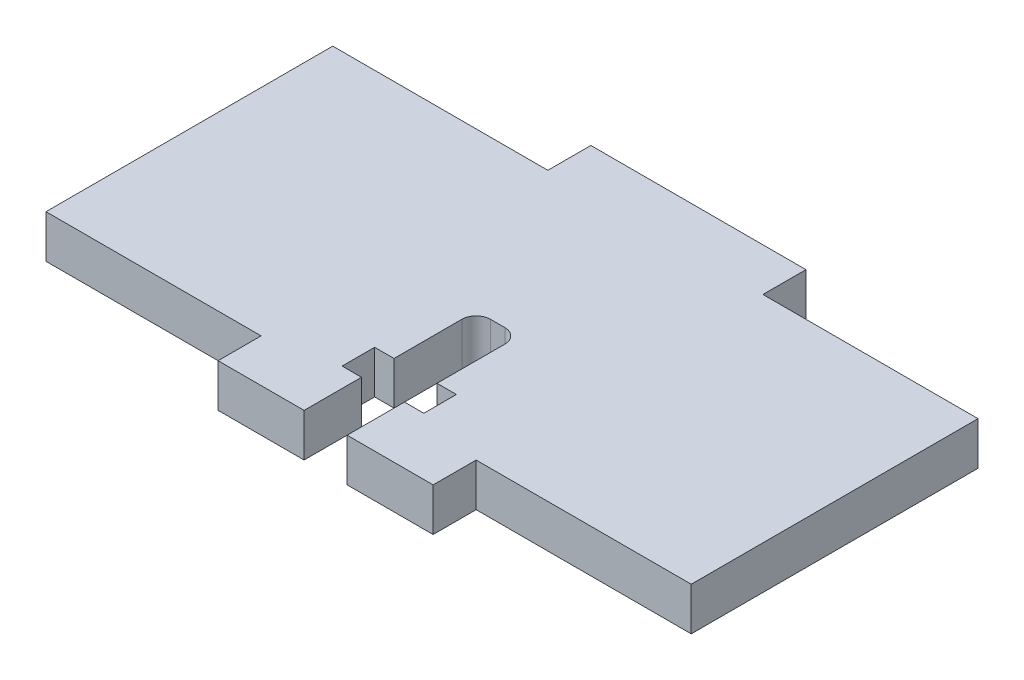
ISO-10303-21;
HEADER;
FILE_DESCRIPTION(('STEP AP214'),'2;1');
FILE_NAME('part.step','',(''),(''),'','','');
FILE_SCHEMA(('AUTOMOTIVE_DESIGN { 1 0 10303 214 1 1 1 1 }'));
ENDSEC;
DATA;
#1=APPLICATION_CONTEXT('core data for automotive mechanical design processes');
#2=APPLICATION_PROTOCOL_DEFINITION('international standard','automotive_design',2000,#1);
#3=PRODUCT_CONTEXT('',#1,'mechanical');
#4=PRODUCT('Part','Part','',(#3));
#5=PRODUCT_RELATED_PRODUCT_CATEGORY('part','',(#4));
#6=PRODUCT_DEFINITION_FORMATION('','',#4);
#7=PRODUCT_DEFINITION_CONTEXT('part definition',#1,'design');
#8=PRODUCT_DEFINITION('design','',#6,#7);
#9=PRODUCT_DEFINITION_SHAPE('','',#8);
#10=(LENGTH_UNIT() NAMED_UNIT(*) SI_UNIT(.MILLI.,.METRE.));
#11=(NAMED_UNIT(*) PLANE_ANGLE_UNIT() SI_UNIT($,.RADIAN.));
#12=(NAMED_UNIT(*) SI_UNIT($,.STERADIAN.) SOLID_ANGLE_UNIT());
#13=UNCERTAINTY_MEASURE_WITH_UNIT(LENGTH_MEASURE(1.E-05),#10,'distance_accuracy_value','');
#14=(GEOMETRIC_REPRESENTATION_CONTEXT(3) GLOBAL_UNCERTAINTY_ASSIGNED_CONTEXT((#13)) GLOBAL_UNIT_ASSIGNED_CONTEXT((#10,
#11,#12)) REPRESENTATION_CONTEXT('',''));
#15=CARTESIAN_POINT('',(0.,0.,0.));
#16=DIRECTION('',(0.,0.,1.));
#17=DIRECTION('',(1.,0.,0.));
#18=AXIS2_PLACEMENT_3D('',#15,#16,#17);
#19=CARTESIAN_POINT('',(-7.5,1.5,13.));
#20=DIRECTION('',(0.,0.,-1.));
#21=DIRECTION('',(-1.,0.,0.));
#22=AXIS2_PLACEMENT_3D('',#19,#20,#21);
#23=PLANE('',#22);
#24=DIRECTION('',(1.,0.,0.));
#25=VECTOR('',#24,1.);
#26=CARTESIAN_POINT('',(-7.5,-1.5,13.));
#27=LINE('',#26,#25);
#28=CARTESIAN_POINT('',(-7.5,-1.5,13.));
#29=VERTEX_POINT('',#28);
#30=CARTESIAN_POINT('',(-1.5,-1.5,13.));
#31=VERTEX_POINT('',#30);
#32=EDGE_CURVE('E227',#29,#31,#27,.T.);
#33=ORIENTED_EDGE('',*,*,#32,.T.);
#34=DIRECTION('',(0.,1.,0.));
#35=VECTOR('',#34,1.);
#36=CARTESIAN_POINT('',(-1.5,-1.5,13.));
#37=LINE('',#36,#35);
#38=CARTESIAN_POINT('',(-1.5,1.5,13.));
#39=VERTEX_POINT('',#38);
#40=EDGE_CURVE('E213',#31,#39,#37,.T.);
#41=ORIENTED_EDGE('',*,*,#40,.T.);
#42=DIRECTION('',(1.,0.,0.));
#43=VECTOR('',#42,1.);
#44=CARTESIAN_POINT('',(-7.5,1.5,13.));
#45=LINE('',#44,#43);
#46=CARTESIAN_POINT('',(-7.5,1.5,13.));
#47=VERTEX_POINT('',#46);
#48=EDGE_CURVE('E225',#47,#39,#45,.T.);
#49=ORIENTED_EDGE('',*,*,#48,.F.);
#50=DIRECTION('',(0.,-1.,0.));
#51=VECTOR('',#50,1.);
#52=CARTESIAN_POINT('',(-7.5,1.5,13.));
#53=LINE('',#52,#51);
#54=EDGE_CURVE('E258',#47,#29,#53,.T.);
#55=ORIENTED_EDGE('',*,*,#54,.T.);
#56=EDGE_LOOP('',(#33,#41,#49,#55));
#57=FACE_BOUND('',#56,.T.);
#58=ADVANCED_FACE('F35',(#57),#23,.F.);
#59=CARTESIAN_POINT('',(22.5,1.5,-10.));
#60=DIRECTION('',(0.,0.,1.));
#61=DIRECTION('',(1.,0.,0.));
#62=AXIS2_PLACEMENT_3D('',#59,#60,#61);
#63=PLANE('',#62);
#64=DIRECTION('',(0.,-1.,0.));
#65=VECTOR('',#64,1.);
#66=CARTESIAN_POINT('',(7.5,1.5,-10.));
#67=LINE('',#66,#65);
#68=CARTESIAN_POINT('',(7.5,1.5,-10.));
#69=VERTEX_POINT('',#68);
#70=CARTESIAN_POINT('',(7.5,-1.5,-10.));
#71=VERTEX_POINT('',#70);
#72=EDGE_CURVE('E247',#69,#71,#67,.T.);
#73=ORIENTED_EDGE('',*,*,#72,.F.);
#74=DIRECTION('',(-1.,0.,0.));
#75=VECTOR('',#74,1.);
#76=CARTESIAN_POINT('',(22.5,1.5,-10.));
#77=LINE('',#76,#75);
#78=CARTESIAN_POINT('',(22.5,1.5,-10.));
#79=VERTEX_POINT('',#78);
#80=EDGE_CURVE('E271',#79,#69,#77,.T.);
#81=ORIENTED_EDGE('',*,*,#80,.F.);
#82=DIRECTION('',(0.,-1.,0.));
#83=VECTOR('',#82,1.);
#84=CARTESIAN_POINT('',(22.5,1.5,-10.));
#85=LINE('',#84,#83);
#86=CARTESIAN_POINT('',(22.5,-1.5,-10.));
#87=VERTEX_POINT('',#86);
#88=EDGE_CURVE('E288',#79,#87,#85,.T.);
#89=ORIENTED_EDGE('',*,*,#88,.T.);
#90=DIRECTION('',(-1.,0.,0.));
#91=VECTOR('',#90,1.);
#92=CARTESIAN_POINT('',(22.5,-1.5,-10.));
#93=LINE('',#92,#91);
#94=EDGE_CURVE('E265',#87,#71,#93,.T.);
#95=ORIENTED_EDGE('',*,*,#94,.T.);
#96=EDGE_LOOP('',(#73,#81,#89,#95));
#97=FACE_BOUND('',#96,.T.);
#98=ADVANCED_FACE('F310',(#97),#63,.F.);
#99=CARTESIAN_POINT('',(22.5,1.5,10.));
#100=DIRECTION('',(0.,0.,-1.));
#101=DIRECTION('',(-1.,0.,0.));
#102=AXIS2_PLACEMENT_3D('',#99,#100,#101);
#103=PLANE('',#102);
#104=DIRECTION('',(0.,-1.,0.));
#105=VECTOR('',#104,1.);
#106=CARTESIAN_POINT('',(-7.5,1.5,10.));
#107=LINE('',#106,#105);
#108=CARTESIAN_POINT('',(-7.5,1.5,10.));
#109=VERTEX_POINT('',#108);
#110=CARTESIAN_POINT('',(-7.5,-1.5,10.));
#111=VERTEX_POINT('',#110);
#112=EDGE_CURVE('E238',#109,#111,#107,.T.);
#113=ORIENTED_EDGE('',*,*,#112,.F.);
#114=DIRECTION('',(1.,0.,0.));
#115=VECTOR('',#114,1.);
#116=CARTESIAN_POINT('',(22.5,1.5,10.));
#117=LINE('',#116,#115);
#118=CARTESIAN_POINT('',(-22.5,1.5,10.));
#119=VERTEX_POINT('',#118);
#120=EDGE_CURVE('E266',#119,#109,#117,.T.);
#121=ORIENTED_EDGE('',*,*,#120,.F.);
#122=DIRECTION('',(0.,-1.,0.));
#123=VECTOR('',#122,1.);
#124=CARTESIAN_POINT('',(-22.5,1.5,10.));
#125=LINE('',#124,#123);
#126=CARTESIAN_POINT('',(-22.5,-1.5,10.));
#127=VERTEX_POINT('',#126);
#128=EDGE_CURVE('E11',#119,#127,#125,.T.);
#129=ORIENTED_EDGE('',*,*,#128,.T.);
#130=DIRECTION('',(1.,0.,0.));
#131=VECTOR('',#130,1.);
#132=CARTESIAN_POINT('',(22.5,-1.5,10.));
#133=LINE('',#132,#131);
#134=EDGE_CURVE('E278',#127,#111,#133,.T.);
#135=ORIENTED_EDGE('',*,*,#134,.T.);
#136=EDGE_LOOP('',(#113,#121,#129,#135));
#137=FACE_BOUND('',#136,.T.);
#138=ADVANCED_FACE('F367',(#137),#103,.F.);
#139=CARTESIAN_POINT('',(-22.5,1.5,10.));
#140=DIRECTION('',(1.,0.,0.));
#141=DIRECTION('',(0.,0.,-1.));
#142=AXIS2_PLACEMENT_3D('',#139,#140,#141);
#143=PLANE('',#142);
#144=DIRECTION('',(0.,0.,1.));
#145=VECTOR('',#144,1.);
#146=CARTESIAN_POINT('',(-22.5,-1.5,10.));
#147=LINE('',#146,#145);
#148=CARTESIAN_POINT('',(-22.5,-1.5,-10.));
#149=VERTEX_POINT('',#148);
#150=EDGE_CURVE('E260',#149,#127,#147,.T.);
#151=ORIENTED_EDGE('',*,*,#150,.T.);
#152=ORIENTED_EDGE('',*,*,#128,.F.);
#153=DIRECTION('',(0.,0.,1.));
#154=VECTOR('',#153,1.);
#155=CARTESIAN_POINT('',(-22.5,1.5,10.));
#156=LINE('',#155,#154);
#157=CARTESIAN_POINT('',(-22.5,1.5,-10.));
#158=VERTEX_POINT('',#157);
#159=EDGE_CURVE('E261',#158,#119,#156,.T.);
#160=ORIENTED_EDGE('',*,*,#159,.F.);
#161=DIRECTION('',(0.,-1.,0.));
#162=VECTOR('',#161,1.);
#163=CARTESIAN_POINT('',(-22.5,1.5,-10.));
#164=LINE('',#163,#162);
#165=EDGE_CURVE('E274',#158,#149,#164,.T.);
#166=ORIENTED_EDGE('',*,*,#165,.T.);
#167=EDGE_LOOP('',(#151,#152,#160,#166));
#168=FACE_BOUND('',#167,.T.);
#169=ADVANCED_FACE('F37',(#168),#143,.F.);
#170=CARTESIAN_POINT('',(7.5,1.5,10.));
#171=VERTEX_POINT('',#170);
#172=CARTESIAN_POINT('',(22.5,1.5,10.));
#173=VERTEX_POINT('',#172);
#174=EDGE_CURVE('E264',#171,#173,#117,.T.);
#175=ORIENTED_EDGE('',*,*,#174,.F.);
#176=DIRECTION('',(0.,-1.,0.));
#177=VECTOR('',#176,1.);
#178=CARTESIAN_POINT('',(7.5,1.5,10.));
#179=LINE('',#178,#177);
#180=CARTESIAN_POINT('',(7.5,-1.5,10.));
#181=VERTEX_POINT('',#180);
#182=EDGE_CURVE('E252',#171,#181,#179,.T.);
#183=ORIENTED_EDGE('',*,*,#182,.T.);
#184=CARTESIAN_POINT('',(22.5,-1.5,10.));
#185=VERTEX_POINT('',#184);
#186=EDGE_CURVE('E277',#181,#185,#133,.T.);
#187=ORIENTED_EDGE('',*,*,#186,.T.);
#188=DIRECTION('',(0.,-1.,0.));
#189=VECTOR('',#188,1.);
#190=CARTESIAN_POINT('',(22.5,1.5,10.));
#191=LINE('',#190,#189);
#192=EDGE_CURVE('E43',#173,#185,#191,.T.);
#193=ORIENTED_EDGE('',*,*,#192,.F.);
#194=EDGE_LOOP('',(#175,#183,#187,#193));
#195=FACE_BOUND('',#194,.T.);
#196=ADVANCED_FACE('F316',(#195),#103,.F.);
#197=CARTESIAN_POINT('',(22.5,1.5,10.));
#198=DIRECTION('',(-1.,0.,0.));
#199=DIRECTION('',(0.,0.,1.));
#200=AXIS2_PLACEMENT_3D('',#197,#198,#199);
#201=PLANE('',#200);
#202=DIRECTION('',(0.,0.,-1.));
#203=VECTOR('',#202,1.);
#204=CARTESIAN_POINT('',(22.5,-1.5,10.));
#205=LINE('',#204,#203);
#206=EDGE_CURVE('E281',#185,#87,#205,.T.);
#207=ORIENTED_EDGE('',*,*,#206,.T.);
#208=ORIENTED_EDGE('',*,*,#88,.F.);
#209=DIRECTION('',(0.,0.,-1.));
#210=VECTOR('',#209,1.);
#211=CARTESIAN_POINT('',(22.5,1.5,10.));
#212=LINE('',#211,#210);
#213=EDGE_CURVE('E268',#173,#79,#212,.T.);
#214=ORIENTED_EDGE('',*,*,#213,.F.);
#215=ORIENTED_EDGE('',*,*,#192,.T.);
#216=EDGE_LOOP('',(#207,#208,#214,#215));
#217=FACE_BOUND('',#216,.T.);
#218=ADVANCED_FACE('F295',(#217),#201,.F.);
#219=CARTESIAN_POINT('',(-7.5,1.5,-10.));
#220=VERTEX_POINT('',#219);
#221=EDGE_CURVE('E270',#220,#158,#77,.T.);
#222=ORIENTED_EDGE('',*,*,#221,.F.);
#223=DIRECTION('',(0.,-1.,0.));
#224=VECTOR('',#223,1.);
#225=CARTESIAN_POINT('',(-7.5,1.5,-10.));
#226=LINE('',#225,#224);
#227=CARTESIAN_POINT('',(-7.49999999999999,-1.5,-10.));
#228=VERTEX_POINT('',#227);
#229=EDGE_CURVE('E338',#220,#228,#226,.T.);
#230=ORIENTED_EDGE('',*,*,#229,.T.);
#231=EDGE_CURVE('E283',#228,#149,#93,.T.);
#232=ORIENTED_EDGE('',*,*,#231,.T.);
#233=ORIENTED_EDGE('',*,*,#165,.F.);
#234=EDGE_LOOP('',(#222,#230,#232,#233));
#235=FACE_BOUND('',#234,.T.);
#236=ADVANCED_FACE('F360',(#235),#63,.F.);
#237=CARTESIAN_POINT('',(0.,1.5,0.));
#238=DIRECTION('',(0.,1.,0.));
#239=DIRECTION('',(0.,0.,1.));
#240=AXIS2_PLACEMENT_3D('',#237,#238,#239);
#241=PLANE('',#240);
#242=DIRECTION('',(0.,0.,1.));
#243=VECTOR('',#242,1.);
#244=CARTESIAN_POINT('',(-1.5,1.5,13.));
#245=LINE('',#244,#243);
#246=CARTESIAN_POINT('',(-1.5,1.5,9.00000000000001));
#247=VERTEX_POINT('',#246);
#248=EDGE_CURVE('E209',#247,#39,#245,.T.);
#249=ORIENTED_EDGE('',*,*,#248,.F.);
#250=DIRECTION('',(1.,0.,0.));
#251=VECTOR('',#250,1.);
#252=CARTESIAN_POINT('',(-2.85,1.5,9.00000000000001));
#253=LINE('',#252,#251);
#254=CARTESIAN_POINT('',(-2.85,1.5,9.00000000000001));
#255=VERTEX_POINT('',#254);
#256=EDGE_CURVE('E374',#255,#247,#253,.T.);
#257=ORIENTED_EDGE('',*,*,#256,.F.);
#258=DIRECTION('',(0.,0.,1.));
#259=VECTOR('',#258,1.);
#260=CARTESIAN_POINT('',(-2.85,1.5,6.73));
#261=LINE('',#260,#259);
#262=CARTESIAN_POINT('',(-2.85,1.5,6.73));
#263=VERTEX_POINT('',#262);
#264=EDGE_CURVE('E378',#263,#255,#261,.T.);
#265=ORIENTED_EDGE('',*,*,#264,.F.);
#266=DIRECTION('',(-1.,0.,0.));
#267=VECTOR('',#266,1.);
#268=CARTESIAN_POINT('',(-2.85,1.5,6.73));
#269=LINE('',#268,#267);
#270=CARTESIAN_POINT('',(-1.5,1.5,6.73));
#271=VERTEX_POINT('',#270);
#272=EDGE_CURVE('E464',#271,#263,#269,.T.);
#273=ORIENTED_EDGE('',*,*,#272,.F.);
#274=DIRECTION('',(0.,0.,1.));
#275=VECTOR('',#274,1.);
#276=CARTESIAN_POINT('',(-1.5,1.5,6.73));
#277=LINE('',#276,#275);
#278=CARTESIAN_POINT('',(-1.5,1.5,2.));
#279=VERTEX_POINT('',#278);
#280=EDGE_CURVE('E461',#279,#271,#277,.T.);
#281=ORIENTED_EDGE('',*,*,#280,.F.);
#282=CARTESIAN_POINT('',(-0.500000000000001,1.5,2.));
#283=DIRECTION('',(0.,1.,0.));
#284=DIRECTION('',(0.,0.,-1.));
#285=AXIS2_PLACEMENT_3D('',#282,#283,#284);
#286=CIRCLE('',#285,1.);
#287=CARTESIAN_POINT('',(-0.500000000000001,1.5,1.));
#288=VERTEX_POINT('',#287);
#289=EDGE_CURVE('E458',#288,#279,#286,.T.);
#290=ORIENTED_EDGE('',*,*,#289,.F.);
#291=DIRECTION('',(-1.,0.,0.));
#292=VECTOR('',#291,1.);
#293=CARTESIAN_POINT('',(-0.500000000000001,1.5,1.));
#294=LINE('',#293,#292);
#295=CARTESIAN_POINT('',(0.500000000000001,1.5,1.));
#296=VERTEX_POINT('',#295);
#297=EDGE_CURVE('E455',#296,#288,#294,.T.);
#298=ORIENTED_EDGE('',*,*,#297,.F.);
#299=CARTESIAN_POINT('',(0.500000000000001,1.5,2.));
#300=DIRECTION('',(0.,1.,0.));
#301=DIRECTION('',(0.,0.,-1.));
#302=AXIS2_PLACEMENT_3D('',#299,#300,#301);
#303=CIRCLE('',#302,1.);
#304=CARTESIAN_POINT('',(1.5,1.5,2.));
#305=VERTEX_POINT('',#304);
#306=EDGE_CURVE('E452',#305,#296,#303,.T.);
#307=ORIENTED_EDGE('',*,*,#306,.F.);
#308=DIRECTION('',(0.,0.,-1.));
#309=VECTOR('',#308,1.);
#310=CARTESIAN_POINT('',(1.5,1.5,6.73));
#311=LINE('',#310,#309);
#312=CARTESIAN_POINT('',(1.5,1.5,6.73));
#313=VERTEX_POINT('',#312);
#314=EDGE_CURVE('E446',#313,#305,#311,.T.);
#315=ORIENTED_EDGE('',*,*,#314,.F.);
#316=DIRECTION('',(-1.,0.,0.));
#317=VECTOR('',#316,1.);
#318=CARTESIAN_POINT('',(1.5,1.5,6.73));
#319=LINE('',#318,#317);
#320=CARTESIAN_POINT('',(2.85,1.5,6.73));
#321=VERTEX_POINT('',#320);
#322=EDGE_CURVE('E444',#321,#313,#319,.T.);
#323=ORIENTED_EDGE('',*,*,#322,.F.);
#324=DIRECTION('',(0.,0.,-1.));
#325=VECTOR('',#324,1.);
#326=CARTESIAN_POINT('',(2.85,1.5,6.73));
#327=LINE('',#326,#325);
#328=CARTESIAN_POINT('',(2.85,1.5,9.00000000000001));
#329=VERTEX_POINT('',#328);
#330=EDGE_CURVE('E434',#329,#321,#327,.T.);
#331=ORIENTED_EDGE('',*,*,#330,.F.);
#332=DIRECTION('',(1.,0.,0.));
#333=VECTOR('',#332,1.);
#334=CARTESIAN_POINT('',(1.5,1.5,9.00000000000001));
#335=LINE('',#334,#333);
#336=CARTESIAN_POINT('',(1.5,1.5,9.00000000000001));
#337=VERTEX_POINT('',#336);
#338=EDGE_CURVE('E439',#337,#329,#335,.T.);
#339=ORIENTED_EDGE('',*,*,#338,.F.);
#340=DIRECTION('',(0.,0.,-1.));
#341=VECTOR('',#340,1.);
#342=CARTESIAN_POINT('',(1.5,1.5,13.));
#343=LINE('',#342,#341);
#344=CARTESIAN_POINT('',(1.5,1.5,13.));
#345=VERTEX_POINT('',#344);
#346=EDGE_CURVE('E220',#345,#337,#343,.T.);
#347=ORIENTED_EDGE('',*,*,#346,.F.);
#348=CARTESIAN_POINT('',(7.5,1.5,13.));
#349=VERTEX_POINT('',#348);
#350=EDGE_CURVE('E236',#345,#349,#45,.T.);
#351=ORIENTED_EDGE('',*,*,#350,.T.);
#352=DIRECTION('',(0.,0.,-1.));
#353=VECTOR('',#352,1.);
#354=CARTESIAN_POINT('',(7.5,1.5,10.));
#355=LINE('',#354,#353);
#356=EDGE_CURVE('E235',#349,#171,#355,.T.);
#357=ORIENTED_EDGE('',*,*,#356,.T.);
#358=ORIENTED_EDGE('',*,*,#174,.T.);
#359=ORIENTED_EDGE('',*,*,#213,.T.);
#360=ORIENTED_EDGE('',*,*,#80,.T.);
#361=DIRECTION('',(0.,0.,-1.));
#362=VECTOR('',#361,1.);
#363=CARTESIAN_POINT('',(7.5,1.5,-10.));
#364=LINE('',#363,#362);
#365=CARTESIAN_POINT('',(7.5,1.5,-13.));
#366=VERTEX_POINT('',#365);
#367=EDGE_CURVE('E312',#69,#366,#364,.T.);
#368=ORIENTED_EDGE('',*,*,#367,.T.);
#369=DIRECTION('',(-1.,0.,0.));
#370=VECTOR('',#369,1.);
#371=CARTESIAN_POINT('',(-7.5,1.5,-13.));
#372=LINE('',#371,#370);
#373=CARTESIAN_POINT('',(-7.5,1.5,-13.));
#374=VERTEX_POINT('',#373);
#375=EDGE_CURVE('E334',#366,#374,#372,.T.);
#376=ORIENTED_EDGE('',*,*,#375,.T.);
#377=DIRECTION('',(0.,0.,1.));
#378=VECTOR('',#377,1.);
#379=CARTESIAN_POINT('',(-7.5,1.5,-10.));
#380=LINE('',#379,#378);
#381=EDGE_CURVE('E336',#374,#220,#380,.T.);
#382=ORIENTED_EDGE('',*,*,#381,.T.);
#383=ORIENTED_EDGE('',*,*,#221,.T.);
#384=ORIENTED_EDGE('',*,*,#159,.T.);
#385=ORIENTED_EDGE('',*,*,#120,.T.);
#386=DIRECTION('',(0.,0.,1.));
#387=VECTOR('',#386,1.);
#388=CARTESIAN_POINT('',(-7.5,1.5,10.));
#389=LINE('',#388,#387);
#390=EDGE_CURVE('E233',#109,#47,#389,.T.);
#391=ORIENTED_EDGE('',*,*,#390,.T.);
#392=ORIENTED_EDGE('',*,*,#48,.T.);
#393=EDGE_LOOP('',(#249,#257,#265,#273,#281,#290,#298,#307,#315,#323,#331,#339,#347,#351,#357,
#358,#359,#360,#368,#376,#382,#383,#384,#385,#391,#392));
#394=FACE_BOUND('',#393,.T.);
#395=ADVANCED_FACE('F231',(#394),#241,.T.);
#396=CARTESIAN_POINT('',(0.,-1.5,0.));
#397=DIRECTION('',(0.,1.,0.));
#398=DIRECTION('',(0.,0.,1.));
#399=AXIS2_PLACEMENT_3D('',#396,#397,#398);
#400=PLANE('',#399);
#401=DIRECTION('',(1.,0.,0.));
#402=VECTOR('',#401,1.);
#403=CARTESIAN_POINT('',(-2.85,-1.5,9.00000000000001));
#404=LINE('',#403,#402);
#405=CARTESIAN_POINT('',(-2.85,-1.5,9.00000000000001));
#406=VERTEX_POINT('',#405);
#407=CARTESIAN_POINT('',(-1.5,-1.5,9.00000000000001));
#408=VERTEX_POINT('',#407);
#409=EDGE_CURVE('E229',#406,#408,#404,.T.);
#410=ORIENTED_EDGE('',*,*,#409,.T.);
#411=DIRECTION('',(0.,0.,1.));
#412=VECTOR('',#411,1.);
#413=CARTESIAN_POINT('',(-1.5,-1.5,13.));
#414=LINE('',#413,#412);
#415=EDGE_CURVE('E371',#408,#31,#414,.T.);
#416=ORIENTED_EDGE('',*,*,#415,.T.);
#417=ORIENTED_EDGE('',*,*,#32,.F.);
#418=DIRECTION('',(0.,0.,1.));
#419=VECTOR('',#418,1.);
#420=CARTESIAN_POINT('',(-7.5,-1.5,10.));
#421=LINE('',#420,#419);
#422=EDGE_CURVE('E243',#111,#29,#421,.T.);
#423=ORIENTED_EDGE('',*,*,#422,.F.);
#424=ORIENTED_EDGE('',*,*,#134,.F.);
#425=ORIENTED_EDGE('',*,*,#150,.F.);
#426=ORIENTED_EDGE('',*,*,#231,.F.);
#427=DIRECTION('',(0.,0.,1.));
#428=VECTOR('',#427,1.);
#429=CARTESIAN_POINT('',(-7.5,-1.5,-10.));
#430=LINE('',#429,#428);
#431=CARTESIAN_POINT('',(-7.5,-1.5,-13.));
#432=VERTEX_POINT('',#431);
#433=EDGE_CURVE('E58',#432,#228,#430,.T.);
#434=ORIENTED_EDGE('',*,*,#433,.F.);
#435=DIRECTION('',(-1.,0.,0.));
#436=VECTOR('',#435,1.);
#437=CARTESIAN_POINT('',(-7.5,-1.5,-13.));
#438=LINE('',#437,#436);
#439=CARTESIAN_POINT('',(7.5,-1.5,-13.));
#440=VERTEX_POINT('',#439);
#441=EDGE_CURVE('E340',#440,#432,#438,.T.);
#442=ORIENTED_EDGE('',*,*,#441,.F.);
#443=DIRECTION('',(0.,0.,-1.));
#444=VECTOR('',#443,1.);
#445=CARTESIAN_POINT('',(7.5,-1.5,-10.));
#446=LINE('',#445,#444);
#447=EDGE_CURVE('E306',#71,#440,#446,.T.);
#448=ORIENTED_EDGE('',*,*,#447,.F.);
#449=ORIENTED_EDGE('',*,*,#94,.F.);
#450=ORIENTED_EDGE('',*,*,#206,.F.);
#451=ORIENTED_EDGE('',*,*,#186,.F.);
#452=DIRECTION('',(0.,0.,-1.));
#453=VECTOR('',#452,1.);
#454=CARTESIAN_POINT('',(7.5,-1.5,10.));
#455=LINE('',#454,#453);
#456=CARTESIAN_POINT('',(7.5,-1.5,13.));
#457=VERTEX_POINT('',#456);
#458=EDGE_CURVE('E249',#457,#181,#455,.T.);
#459=ORIENTED_EDGE('',*,*,#458,.F.);
#460=CARTESIAN_POINT('',(1.5,-1.5,13.));
#461=VERTEX_POINT('',#460);
#462=EDGE_CURVE('E246',#461,#457,#27,.T.);
#463=ORIENTED_EDGE('',*,*,#462,.F.);
#464=DIRECTION('',(0.,0.,-1.));
#465=VECTOR('',#464,1.);
#466=CARTESIAN_POINT('',(1.5,-1.5,13.));
#467=LINE('',#466,#465);
#468=CARTESIAN_POINT('',(1.5,-1.5,9.00000000000001));
#469=VERTEX_POINT('',#468);
#470=EDGE_CURVE('E50',#461,#469,#467,.T.);
#471=ORIENTED_EDGE('',*,*,#470,.T.);
#472=DIRECTION('',(1.,0.,0.));
#473=VECTOR('',#472,1.);
#474=CARTESIAN_POINT('',(1.5,-1.5,9.00000000000001));
#475=LINE('',#474,#473);
#476=CARTESIAN_POINT('',(2.85,-1.5,9.00000000000001));
#477=VERTEX_POINT('',#476);
#478=EDGE_CURVE('E376',#469,#477,#475,.T.);
#479=ORIENTED_EDGE('',*,*,#478,.T.);
#480=DIRECTION('',(0.,0.,-1.));
#481=VECTOR('',#480,1.);
#482=CARTESIAN_POINT('',(2.85,-1.5,6.73));
#483=LINE('',#482,#481);
#484=CARTESIAN_POINT('',(2.85,-1.5,6.73));
#485=VERTEX_POINT('',#484);
#486=EDGE_CURVE('E383',#477,#485,#483,.T.);
#487=ORIENTED_EDGE('',*,*,#486,.T.);
#488=DIRECTION('',(-1.,0.,0.));
#489=VECTOR('',#488,1.);
#490=CARTESIAN_POINT('',(1.5,-1.5,6.73));
#491=LINE('',#490,#489);
#492=CARTESIAN_POINT('',(1.5,-1.5,6.73));
#493=VERTEX_POINT('',#492);
#494=EDGE_CURVE('E386',#485,#493,#491,.T.);
#495=ORIENTED_EDGE('',*,*,#494,.T.);
#496=DIRECTION('',(0.,0.,-1.));
#497=VECTOR('',#496,1.);
#498=CARTESIAN_POINT('',(1.5,-1.5,6.73));
#499=LINE('',#498,#497);
#500=CARTESIAN_POINT('',(1.5,-1.5,2.));
#501=VERTEX_POINT('',#500);
#502=EDGE_CURVE('E389',#493,#501,#499,.T.);
#503=ORIENTED_EDGE('',*,*,#502,.T.);
#504=CARTESIAN_POINT('',(0.500000000000001,-1.5,2.));
#505=DIRECTION('',(0.,1.,0.));
#506=DIRECTION('',(0.,0.,-1.));
#507=AXIS2_PLACEMENT_3D('',#504,#505,#506);
#508=CIRCLE('',#507,1.);
#509=CARTESIAN_POINT('',(0.500000000000001,-1.5,1.));
#510=VERTEX_POINT('',#509);
#511=EDGE_CURVE('E392',#501,#510,#508,.T.);
#512=ORIENTED_EDGE('',*,*,#511,.T.);
#513=DIRECTION('',(-1.,0.,0.));
#514=VECTOR('',#513,1.);
#515=CARTESIAN_POINT('',(-0.500000000000001,-1.5,1.));
#516=LINE('',#515,#514);
#517=CARTESIAN_POINT('',(-0.500000000000001,-1.5,1.));
#518=VERTEX_POINT('',#517);
#519=EDGE_CURVE('E395',#510,#518,#516,.T.);
#520=ORIENTED_EDGE('',*,*,#519,.T.);
#521=CARTESIAN_POINT('',(-0.500000000000001,-1.5,2.));
#522=DIRECTION('',(0.,1.,0.));
#523=DIRECTION('',(0.,0.,-1.));
#524=AXIS2_PLACEMENT_3D('',#521,#522,#523);
#525=CIRCLE('',#524,1.);
#526=CARTESIAN_POINT('',(-1.5,-1.5,2.));
#527=VERTEX_POINT('',#526);
#528=EDGE_CURVE('E398',#518,#527,#525,.T.);
#529=ORIENTED_EDGE('',*,*,#528,.T.);
#530=DIRECTION('',(0.,0.,1.));
#531=VECTOR('',#530,1.);
#532=CARTESIAN_POINT('',(-1.5,-1.5,6.73));
#533=LINE('',#532,#531);
#534=CARTESIAN_POINT('',(-1.5,-1.5,6.73));
#535=VERTEX_POINT('',#534);
#536=EDGE_CURVE('E401',#527,#535,#533,.T.);
#537=ORIENTED_EDGE('',*,*,#536,.T.);
#538=DIRECTION('',(-1.,0.,0.));
#539=VECTOR('',#538,1.);
#540=CARTESIAN_POINT('',(-2.85,-1.5,6.73));
#541=LINE('',#540,#539);
#542=CARTESIAN_POINT('',(-2.85,-1.5,6.73));
#543=VERTEX_POINT('',#542);
#544=EDGE_CURVE('E404',#535,#543,#541,.T.);
#545=ORIENTED_EDGE('',*,*,#544,.T.);
#546=DIRECTION('',(0.,0.,1.));
#547=VECTOR('',#546,1.);
#548=CARTESIAN_POINT('',(-2.85,-1.5,6.73));
#549=LINE('',#548,#547);
#550=EDGE_CURVE('E407',#543,#406,#549,.T.);
#551=ORIENTED_EDGE('',*,*,#550,.T.);
#552=EDGE_LOOP('',(#410,#416,#417,#423,#424,#425,#426,#434,#442,#448,#449,#450,#451,#459,#463,
#471,#479,#487,#495,#503,#512,#520,#529,#537,#545,#551));
#553=FACE_BOUND('',#552,.T.);
#554=ADVANCED_FACE('F303',(#553),#400,.F.);
#555=CARTESIAN_POINT('',(-7.5,1.5,10.));
#556=DIRECTION('',(1.,0.,0.));
#557=DIRECTION('',(0.,0.,-1.));
#558=AXIS2_PLACEMENT_3D('',#555,#556,#557);
#559=PLANE('',#558);
#560=ORIENTED_EDGE('',*,*,#422,.T.);
#561=ORIENTED_EDGE('',*,*,#54,.F.);
#562=ORIENTED_EDGE('',*,*,#390,.F.);
#563=ORIENTED_EDGE('',*,*,#112,.T.);
#564=EDGE_LOOP('',(#560,#561,#562,#563));
#565=FACE_BOUND('',#564,.T.);
#566=ADVANCED_FACE('F370',(#565),#559,.F.);
#567=ORIENTED_EDGE('',*,*,#350,.F.);
#568=DIRECTION('',(0.,1.,0.));
#569=VECTOR('',#568,1.);
#570=CARTESIAN_POINT('',(1.5,-1.5,13.));
#571=LINE('',#570,#569);
#572=EDGE_CURVE('E228',#461,#345,#571,.T.);
#573=ORIENTED_EDGE('',*,*,#572,.F.);
#574=ORIENTED_EDGE('',*,*,#462,.T.);
#575=DIRECTION('',(0.,-1.,0.));
#576=VECTOR('',#575,1.);
#577=CARTESIAN_POINT('',(7.5,1.5,13.));
#578=LINE('',#577,#576);
#579=EDGE_CURVE('E255',#349,#457,#578,.T.);
#580=ORIENTED_EDGE('',*,*,#579,.F.);
#581=EDGE_LOOP('',(#567,#573,#574,#580));
#582=FACE_BOUND('',#581,.T.);
#583=ADVANCED_FACE('F324',(#582),#23,.F.);
#584=CARTESIAN_POINT('',(7.5,1.5,10.));
#585=DIRECTION('',(-1.,0.,0.));
#586=DIRECTION('',(0.,0.,1.));
#587=AXIS2_PLACEMENT_3D('',#584,#585,#586);
#588=PLANE('',#587);
#589=ORIENTED_EDGE('',*,*,#458,.T.);
#590=ORIENTED_EDGE('',*,*,#182,.F.);
#591=ORIENTED_EDGE('',*,*,#356,.F.);
#592=ORIENTED_EDGE('',*,*,#579,.T.);
#593=EDGE_LOOP('',(#589,#590,#591,#592));
#594=FACE_BOUND('',#593,.T.);
#595=ADVANCED_FACE('F318',(#594),#588,.F.);
#596=CARTESIAN_POINT('',(7.5,1.5,-10.));
#597=DIRECTION('',(-1.,0.,0.));
#598=DIRECTION('',(0.,0.,1.));
#599=AXIS2_PLACEMENT_3D('',#596,#597,#598);
#600=PLANE('',#599);
#601=ORIENTED_EDGE('',*,*,#447,.T.);
#602=DIRECTION('',(0.,-1.,0.));
#603=VECTOR('',#602,1.);
#604=CARTESIAN_POINT('',(7.5,1.5,-13.));
#605=LINE('',#604,#603);
#606=EDGE_CURVE('E346',#366,#440,#605,.T.);
#607=ORIENTED_EDGE('',*,*,#606,.F.);
#608=ORIENTED_EDGE('',*,*,#367,.F.);
#609=ORIENTED_EDGE('',*,*,#72,.T.);
#610=EDGE_LOOP('',(#601,#607,#608,#609));
#611=FACE_BOUND('',#610,.T.);
#612=ADVANCED_FACE('F349',(#611),#600,.F.);
#613=CARTESIAN_POINT('',(-7.5,1.5,-13.));
#614=DIRECTION('',(0.,0.,1.));
#615=DIRECTION('',(1.,0.,0.));
#616=AXIS2_PLACEMENT_3D('',#613,#614,#615);
#617=PLANE('',#616);
#618=ORIENTED_EDGE('',*,*,#441,.T.);
#619=DIRECTION('',(0.,-1.,0.));
#620=VECTOR('',#619,1.);
#621=CARTESIAN_POINT('',(-7.5,1.5,-13.));
#622=LINE('',#621,#620);
#623=EDGE_CURVE('E344',#374,#432,#622,.T.);
#624=ORIENTED_EDGE('',*,*,#623,.F.);
#625=ORIENTED_EDGE('',*,*,#375,.F.);
#626=ORIENTED_EDGE('',*,*,#606,.T.);
#627=EDGE_LOOP('',(#618,#624,#625,#626));
#628=FACE_BOUND('',#627,.T.);
#629=ADVANCED_FACE('F353',(#628),#617,.F.);
#630=CARTESIAN_POINT('',(-7.5,1.5,-10.));
#631=DIRECTION('',(1.,0.,0.));
#632=DIRECTION('',(0.,0.,-1.));
#633=AXIS2_PLACEMENT_3D('',#630,#631,#632);
#634=PLANE('',#633);
#635=ORIENTED_EDGE('',*,*,#433,.T.);
#636=ORIENTED_EDGE('',*,*,#229,.F.);
#637=ORIENTED_EDGE('',*,*,#381,.F.);
#638=ORIENTED_EDGE('',*,*,#623,.T.);
#639=EDGE_LOOP('',(#635,#636,#637,#638));
#640=FACE_BOUND('',#639,.T.);
#641=ADVANCED_FACE('F357',(#640),#634,.F.);
#642=CARTESIAN_POINT('',(-1.5,-1.5,13.));
#643=DIRECTION('',(-1.,0.,0.));
#644=DIRECTION('',(0.,0.,1.));
#645=AXIS2_PLACEMENT_3D('',#642,#643,#644);
#646=PLANE('',#645);
#647=ORIENTED_EDGE('',*,*,#40,.F.);
#648=ORIENTED_EDGE('',*,*,#415,.F.);
#649=DIRECTION('',(0.,1.,0.));
#650=VECTOR('',#649,1.);
#651=CARTESIAN_POINT('',(-1.5,-1.5,9.00000000000001));
#652=LINE('',#651,#650);
#653=EDGE_CURVE('E215',#408,#247,#652,.T.);
#654=ORIENTED_EDGE('',*,*,#653,.T.);
#655=ORIENTED_EDGE('',*,*,#248,.T.);
#656=EDGE_LOOP('',(#647,#648,#654,#655));
#657=FACE_BOUND('',#656,.T.);
#658=ADVANCED_FACE('F211',(#657),#646,.F.);
#659=CARTESIAN_POINT('',(-2.85,-1.5,9.00000000000001));
#660=DIRECTION('',(0.,0.,1.));
#661=DIRECTION('',(1.,0.,0.));
#662=AXIS2_PLACEMENT_3D('',#659,#660,#661);
#663=PLANE('',#662);
#664=ORIENTED_EDGE('',*,*,#653,.F.);
#665=ORIENTED_EDGE('',*,*,#409,.F.);
#666=DIRECTION('',(0.,1.,0.));
#667=VECTOR('',#666,1.);
#668=CARTESIAN_POINT('',(-2.85,-1.5,9.00000000000001));
#669=LINE('',#668,#667);
#670=EDGE_CURVE('E411',#406,#255,#669,.T.);
#671=ORIENTED_EDGE('',*,*,#670,.T.);
#672=ORIENTED_EDGE('',*,*,#256,.T.);
#673=EDGE_LOOP('',(#664,#665,#671,#672));
#674=FACE_BOUND('',#673,.T.);
#675=ADVANCED_FACE('F473',(#674),#663,.F.);
#676=CARTESIAN_POINT('',(-2.85,-1.5,6.73));
#677=DIRECTION('',(-1.,0.,0.));
#678=DIRECTION('',(0.,0.,1.));
#679=AXIS2_PLACEMENT_3D('',#676,#677,#678);
#680=PLANE('',#679);
#681=ORIENTED_EDGE('',*,*,#670,.F.);
#682=ORIENTED_EDGE('',*,*,#550,.F.);
#683=DIRECTION('',(0.,1.,0.));
#684=VECTOR('',#683,1.);
#685=CARTESIAN_POINT('',(-2.85,-1.5,6.73));
#686=LINE('',#685,#684);
#687=EDGE_CURVE('E413',#543,#263,#686,.T.);
#688=ORIENTED_EDGE('',*,*,#687,.T.);
#689=ORIENTED_EDGE('',*,*,#264,.T.);
#690=EDGE_LOOP('',(#681,#682,#688,#689));
#691=FACE_BOUND('',#690,.T.);
#692=ADVANCED_FACE('F469',(#691),#680,.F.);
#693=CARTESIAN_POINT('',(-2.85,-1.5,6.73));
#694=DIRECTION('',(0.,0.,-1.));
#695=DIRECTION('',(-1.,0.,0.));
#696=AXIS2_PLACEMENT_3D('',#693,#694,#695);
#697=PLANE('',#696);
#698=ORIENTED_EDGE('',*,*,#687,.F.);
#699=ORIENTED_EDGE('',*,*,#544,.F.);
#700=DIRECTION('',(0.,1.,0.));
#701=VECTOR('',#700,1.);
#702=CARTESIAN_POINT('',(-1.5,-1.5,6.73));
#703=LINE('',#702,#701);
#704=EDGE_CURVE('E415',#535,#271,#703,.T.);
#705=ORIENTED_EDGE('',*,*,#704,.T.);
#706=ORIENTED_EDGE('',*,*,#272,.T.);
#707=EDGE_LOOP('',(#698,#699,#705,#706));
#708=FACE_BOUND('',#707,.T.);
#709=ADVANCED_FACE('F477',(#708),#697,.F.);
#710=CARTESIAN_POINT('',(-1.5,-1.5,6.73));
#711=DIRECTION('',(-1.,0.,0.));
#712=DIRECTION('',(0.,0.,1.));
#713=AXIS2_PLACEMENT_3D('',#710,#711,#712);
#714=PLANE('',#713);
#715=ORIENTED_EDGE('',*,*,#704,.F.);
#716=ORIENTED_EDGE('',*,*,#536,.F.);
#717=DIRECTION('',(0.,1.,0.));
#718=VECTOR('',#717,1.);
#719=CARTESIAN_POINT('',(-1.5,-1.5,2.));
#720=LINE('',#719,#718);
#721=EDGE_CURVE('E417',#527,#279,#720,.T.);
#722=ORIENTED_EDGE('',*,*,#721,.T.);
#723=ORIENTED_EDGE('',*,*,#280,.T.);
#724=EDGE_LOOP('',(#715,#716,#722,#723));
#725=FACE_BOUND('',#724,.T.);
#726=ADVANCED_FACE('F482',(#725),#714,.F.);
#727=CARTESIAN_POINT('',(-0.500000000000001,-1.5,2.));
#728=DIRECTION('',(0.,1.,0.));
#729=DIRECTION('',(0.,0.,1.));
#730=AXIS2_PLACEMENT_3D('',#727,#728,#729);
#731=CYLINDRICAL_SURFACE('',#730,1.);
#732=ORIENTED_EDGE('',*,*,#721,.F.);
#733=ORIENTED_EDGE('',*,*,#528,.F.);
#734=DIRECTION('',(0.,1.,0.));
#735=VECTOR('',#734,1.);
#736=CARTESIAN_POINT('',(-0.500000000000001,-1.5,1.));
#737=LINE('',#736,#735);
#738=EDGE_CURVE('E419',#518,#288,#737,.T.);
#739=ORIENTED_EDGE('',*,*,#738,.T.);
#740=ORIENTED_EDGE('',*,*,#289,.T.);
#741=EDGE_LOOP('',(#732,#733,#739,#740));
#742=FACE_BOUND('',#741,.T.);
#743=ADVANCED_FACE('F485',(#742),#731,.F.);
#744=CARTESIAN_POINT('',(-0.500000000000001,-1.5,1.));
#745=DIRECTION('',(0.,0.,-1.));
#746=DIRECTION('',(-1.,0.,0.));
#747=AXIS2_PLACEMENT_3D('',#744,#745,#746);
#748=PLANE('',#747);
#749=ORIENTED_EDGE('',*,*,#738,.F.);
#750=ORIENTED_EDGE('',*,*,#519,.F.);
#751=DIRECTION('',(0.,1.,0.));
#752=VECTOR('',#751,1.);
#753=CARTESIAN_POINT('',(0.500000000000001,-1.5,1.));
#754=LINE('',#753,#752);
#755=EDGE_CURVE('E421',#510,#296,#754,.T.);
#756=ORIENTED_EDGE('',*,*,#755,.T.);
#757=ORIENTED_EDGE('',*,*,#297,.T.);
#758=EDGE_LOOP('',(#749,#750,#756,#757));
#759=FACE_BOUND('',#758,.T.);
#760=ADVANCED_FACE('F488',(#759),#748,.F.);
#761=CARTESIAN_POINT('',(0.500000000000001,-1.5,2.));
#762=DIRECTION('',(0.,1.,0.));
#763=DIRECTION('',(0.,0.,1.));
#764=AXIS2_PLACEMENT_3D('',#761,#762,#763);
#765=CYLINDRICAL_SURFACE('',#764,1.);
#766=ORIENTED_EDGE('',*,*,#755,.F.);
#767=ORIENTED_EDGE('',*,*,#511,.F.);
#768=DIRECTION('',(0.,1.,0.));
#769=VECTOR('',#768,1.);
#770=CARTESIAN_POINT('',(1.5,-1.5,2.));
#771=LINE('',#770,#769);
#772=EDGE_CURVE('E423',#501,#305,#771,.T.);
#773=ORIENTED_EDGE('',*,*,#772,.T.);
#774=ORIENTED_EDGE('',*,*,#306,.T.);
#775=EDGE_LOOP('',(#766,#767,#773,#774));
#776=FACE_BOUND('',#775,.T.);
#777=ADVANCED_FACE('F491',(#776),#765,.F.);
#778=CARTESIAN_POINT('',(1.5,-1.5,6.73));
#779=DIRECTION('',(1.,0.,0.));
#780=DIRECTION('',(0.,0.,-1.));
#781=AXIS2_PLACEMENT_3D('',#778,#779,#780);
#782=PLANE('',#781);
#783=ORIENTED_EDGE('',*,*,#772,.F.);
#784=ORIENTED_EDGE('',*,*,#502,.F.);
#785=DIRECTION('',(0.,1.,0.));
#786=VECTOR('',#785,1.);
#787=CARTESIAN_POINT('',(1.5,-1.5,6.73));
#788=LINE('',#787,#786);
#789=EDGE_CURVE('E425',#493,#313,#788,.T.);
#790=ORIENTED_EDGE('',*,*,#789,.T.);
#791=ORIENTED_EDGE('',*,*,#314,.T.);
#792=EDGE_LOOP('',(#783,#784,#790,#791));
#793=FACE_BOUND('',#792,.T.);
#794=ADVANCED_FACE('F495',(#793),#782,.F.);
#795=CARTESIAN_POINT('',(1.5,-1.5,6.73));
#796=DIRECTION('',(0.,0.,-1.));
#797=DIRECTION('',(-1.,0.,0.));
#798=AXIS2_PLACEMENT_3D('',#795,#796,#797);
#799=PLANE('',#798);
#800=ORIENTED_EDGE('',*,*,#789,.F.);
#801=ORIENTED_EDGE('',*,*,#494,.F.);
#802=DIRECTION('',(0.,1.,0.));
#803=VECTOR('',#802,1.);
#804=CARTESIAN_POINT('',(2.85,-1.5,6.73));
#805=LINE('',#804,#803);
#806=EDGE_CURVE('E427',#485,#321,#805,.T.);
#807=ORIENTED_EDGE('',*,*,#806,.T.);
#808=ORIENTED_EDGE('',*,*,#322,.T.);
#809=EDGE_LOOP('',(#800,#801,#807,#808));
#810=FACE_BOUND('',#809,.T.);
#811=ADVANCED_FACE('F498',(#810),#799,.F.);
#812=CARTESIAN_POINT('',(2.85,-1.5,6.73));
#813=DIRECTION('',(1.,0.,0.));
#814=DIRECTION('',(0.,0.,-1.));
#815=AXIS2_PLACEMENT_3D('',#812,#813,#814);
#816=PLANE('',#815);
#817=ORIENTED_EDGE('',*,*,#806,.F.);
#818=ORIENTED_EDGE('',*,*,#486,.F.);
#819=DIRECTION('',(0.,1.,0.));
#820=VECTOR('',#819,1.);
#821=CARTESIAN_POINT('',(2.85,-1.5,9.00000000000001));
#822=LINE('',#821,#820);
#823=EDGE_CURVE('E329',#477,#329,#822,.T.);
#824=ORIENTED_EDGE('',*,*,#823,.T.);
#825=ORIENTED_EDGE('',*,*,#330,.T.);
#826=EDGE_LOOP('',(#817,#818,#824,#825));
#827=FACE_BOUND('',#826,.T.);
#828=ADVANCED_FACE('F432',(#827),#816,.F.);
#829=CARTESIAN_POINT('',(1.5,-1.5,9.00000000000001));
#830=DIRECTION('',(0.,0.,1.));
#831=DIRECTION('',(1.,0.,0.));
#832=AXIS2_PLACEMENT_3D('',#829,#830,#831);
#833=PLANE('',#832);
#834=ORIENTED_EDGE('',*,*,#823,.F.);
#835=ORIENTED_EDGE('',*,*,#478,.F.);
#836=DIRECTION('',(0.,1.,0.));
#837=VECTOR('',#836,1.);
#838=CARTESIAN_POINT('',(1.5,-1.5,9.00000000000001));
#839=LINE('',#838,#837);
#840=EDGE_CURVE('E327',#469,#337,#839,.T.);
#841=ORIENTED_EDGE('',*,*,#840,.T.);
#842=ORIENTED_EDGE('',*,*,#338,.T.);
#843=EDGE_LOOP('',(#834,#835,#841,#842));
#844=FACE_BOUND('',#843,.T.);
#845=ADVANCED_FACE('F440',(#844),#833,.F.);
#846=CARTESIAN_POINT('',(1.5,-1.5,13.));
#847=DIRECTION('',(1.,0.,0.));
#848=DIRECTION('',(0.,0.,-1.));
#849=AXIS2_PLACEMENT_3D('',#846,#847,#848);
#850=PLANE('',#849);
#851=ORIENTED_EDGE('',*,*,#840,.F.);
#852=ORIENTED_EDGE('',*,*,#470,.F.);
#853=ORIENTED_EDGE('',*,*,#572,.T.);
#854=ORIENTED_EDGE('',*,*,#346,.T.);
#855=EDGE_LOOP('',(#851,#852,#853,#854));
#856=FACE_BOUND('',#855,.T.);
#857=ADVANCED_FACE('F697',(#856),#850,.F.);
#858=CLOSED_SHELL('',(#58,#98,#138,#169,#196,#218,#236,#395,#554,#566,#583,#595,#612,#629,#641,
#658,#675,#692,#709,#726,#743,#760,#777,#794,#811,#828,#845,#857));
#859=MANIFOLD_SOLID_BREP('B2',#858);
#860=ADVANCED_BREP_SHAPE_REPRESENTATION('',(#18,#859),#14);
#861=SHAPE_DEFINITION_REPRESENTATION(#9,#860);
ENDSEC;
END-ISO-10303-21;
